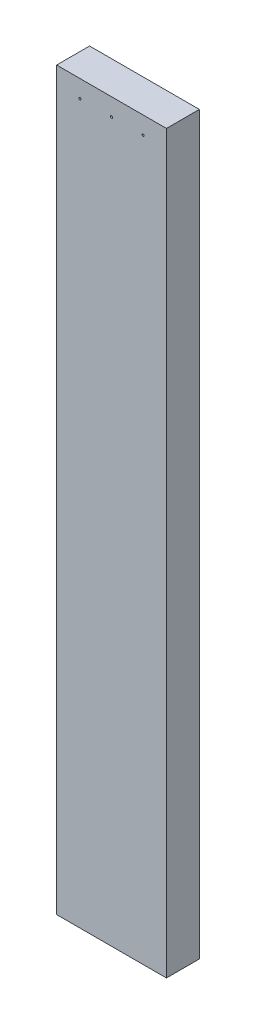
ISO-10303-21;
HEADER;
FILE_DESCRIPTION(('STEP AP214'),'2;1');
FILE_NAME('part.step','',(''),(''),'','','');
FILE_SCHEMA(('AUTOMOTIVE_DESIGN { 1 0 10303 214 1 1 1 1 }'));
ENDSEC;
DATA;
#1=APPLICATION_CONTEXT('core data for automotive mechanical design processes');
#2=APPLICATION_PROTOCOL_DEFINITION('international standard','automotive_design',2000,#1);
#3=PRODUCT_CONTEXT('',#1,'mechanical');
#4=PRODUCT('Part','Part','',(#3));
#5=PRODUCT_RELATED_PRODUCT_CATEGORY('part','',(#4));
#6=PRODUCT_DEFINITION_FORMATION('','',#4);
#7=PRODUCT_DEFINITION_CONTEXT('part definition',#1,'design');
#8=PRODUCT_DEFINITION('design','',#6,#7);
#9=PRODUCT_DEFINITION_SHAPE('','',#8);
#10=(LENGTH_UNIT() NAMED_UNIT(*) SI_UNIT(.MILLI.,.METRE.));
#11=(NAMED_UNIT(*) PLANE_ANGLE_UNIT() SI_UNIT($,.RADIAN.));
#12=(NAMED_UNIT(*) SI_UNIT($,.STERADIAN.) SOLID_ANGLE_UNIT());
#13=UNCERTAINTY_MEASURE_WITH_UNIT(LENGTH_MEASURE(1.E-05),#10,'distance_accuracy_value','');
#14=(GEOMETRIC_REPRESENTATION_CONTEXT(3) GLOBAL_UNCERTAINTY_ASSIGNED_CONTEXT((#13)) GLOBAL_UNIT_ASSIGNED_CONTEXT((#10,
#11,#12)) REPRESENTATION_CONTEXT('',''));
#15=CARTESIAN_POINT('',(0.,0.,0.));
#16=DIRECTION('',(0.,0.,1.));
#17=DIRECTION('',(1.,0.,0.));
#18=AXIS2_PLACEMENT_3D('',#15,#16,#17);
#19=CARTESIAN_POINT('',(0.,425.45,0.));
#20=DIRECTION('',(1.,0.,0.));
#21=DIRECTION('',(0.,0.,-1.));
#22=AXIS2_PLACEMENT_3D('',#19,#20,#21);
#23=PLANE('',#22);
#24=DIRECTION('',(0.,0.,1.));
#25=VECTOR('',#24,1.);
#26=CARTESIAN_POINT('',(0.,0.,0.));
#27=LINE('',#26,#25);
#28=CARTESIAN_POINT('',(0.,0.,-19.05));
#29=VERTEX_POINT('',#28);
#30=CARTESIAN_POINT('',(0.,0.,0.));
#31=VERTEX_POINT('',#30);
#32=EDGE_CURVE('E107',#29,#31,#27,.T.);
#33=ORIENTED_EDGE('',*,*,#32,.T.);
#34=DIRECTION('',(0.,-1.,0.));
#35=VECTOR('',#34,1.);
#36=CARTESIAN_POINT('',(0.,425.45,0.));
#37=LINE('',#36,#35);
#38=CARTESIAN_POINT('',(0.,425.45,0.));
#39=VERTEX_POINT('',#38);
#40=EDGE_CURVE('E11',#39,#31,#37,.T.);
#41=ORIENTED_EDGE('',*,*,#40,.F.);
#42=DIRECTION('',(0.,0.,1.));
#43=VECTOR('',#42,1.);
#44=CARTESIAN_POINT('',(0.,425.45,0.));
#45=LINE('',#44,#43);
#46=CARTESIAN_POINT('',(0.,425.45,-19.05));
#47=VERTEX_POINT('',#46);
#48=EDGE_CURVE('E94',#47,#39,#45,.T.);
#49=ORIENTED_EDGE('',*,*,#48,.F.);
#50=DIRECTION('',(0.,-1.,0.));
#51=VECTOR('',#50,1.);
#52=CARTESIAN_POINT('',(0.,425.45,-19.05));
#53=LINE('',#52,#51);
#54=EDGE_CURVE('E103',#47,#29,#53,.T.);
#55=ORIENTED_EDGE('',*,*,#54,.T.);
#56=EDGE_LOOP('',(#33,#41,#49,#55));
#57=FACE_BOUND('',#56,.T.);
#58=ADVANCED_FACE('F41',(#57),#23,.F.);
#59=CARTESIAN_POINT('',(0.,425.45,0.));
#60=DIRECTION('',(0.,0.,-1.));
#61=DIRECTION('',(-1.,0.,0.));
#62=AXIS2_PLACEMENT_3D('',#59,#60,#61);
#63=PLANE('',#62);
#64=CARTESIAN_POINT('',(13.4873999999976,415.29,0.));
#65=DIRECTION('',(0.,0.,1.));
#66=DIRECTION('',(-1.,0.,0.));
#67=AXIS2_PLACEMENT_3D('',#64,#65,#66);
#68=CIRCLE('',#67,0.634999999999979);
#69=CARTESIAN_POINT('',(12.8523999999976,415.29,0.));
#70=VERTEX_POINT('',#69);
#71=EDGE_CURVE('E158',#70,#70,#68,.T.);
#72=ORIENTED_EDGE('',*,*,#71,.F.);
#73=EDGE_LOOP('',(#72));
#74=FACE_BOUND('',#73,.T.);
#75=CARTESIAN_POINT('',(50.0126000000024,415.29,0.));
#76=DIRECTION('',(0.,0.,1.));
#77=DIRECTION('',(1.,0.,0.));
#78=AXIS2_PLACEMENT_3D('',#75,#76,#77);
#79=CIRCLE('',#78,0.634999999999979);
#80=CARTESIAN_POINT('',(50.6476000000024,415.29,0.));
#81=VERTEX_POINT('',#80);
#82=EDGE_CURVE('E153',#81,#81,#79,.T.);
#83=ORIENTED_EDGE('',*,*,#82,.F.);
#84=EDGE_LOOP('',(#83));
#85=FACE_BOUND('',#84,.T.);
#86=CARTESIAN_POINT('',(31.75,415.29,0.));
#87=DIRECTION('',(0.,0.,1.));
#88=DIRECTION('',(1.,0.,0.));
#89=AXIS2_PLACEMENT_3D('',#86,#87,#88);
#90=CIRCLE('',#89,0.634999999999992);
#91=CARTESIAN_POINT('',(32.385,415.29,0.));
#92=VERTEX_POINT('',#91);
#93=EDGE_CURVE('E142',#92,#92,#90,.T.);
#94=ORIENTED_EDGE('',*,*,#93,.F.);
#95=EDGE_LOOP('',(#94));
#96=FACE_BOUND('',#95,.T.);
#97=DIRECTION('',(1.,0.,0.));
#98=VECTOR('',#97,1.);
#99=CARTESIAN_POINT('',(0.,0.,0.));
#100=LINE('',#99,#98);
#101=CARTESIAN_POINT('',(63.5,0.,0.));
#102=VERTEX_POINT('',#101);
#103=EDGE_CURVE('E98',#31,#102,#100,.T.);
#104=ORIENTED_EDGE('',*,*,#103,.T.);
#105=DIRECTION('',(0.,-1.,0.));
#106=VECTOR('',#105,1.);
#107=CARTESIAN_POINT('',(63.5,425.45,0.));
#108=LINE('',#107,#106);
#109=CARTESIAN_POINT('',(63.5,425.45,0.));
#110=VERTEX_POINT('',#109);
#111=EDGE_CURVE('E50',#110,#102,#108,.T.);
#112=ORIENTED_EDGE('',*,*,#111,.F.);
#113=DIRECTION('',(1.,0.,0.));
#114=VECTOR('',#113,1.);
#115=CARTESIAN_POINT('',(0.,425.45,0.));
#116=LINE('',#115,#114);
#117=EDGE_CURVE('E89',#39,#110,#116,.T.);
#118=ORIENTED_EDGE('',*,*,#117,.F.);
#119=ORIENTED_EDGE('',*,*,#40,.T.);
#120=EDGE_LOOP('',(#104,#112,#118,#119));
#121=FACE_BOUND('',#120,.T.);
#122=ADVANCED_FACE('F97',(#74,#85,#96,#121),#63,.F.);
#123=CARTESIAN_POINT('',(63.5,425.45,0.));
#124=DIRECTION('',(-1.,0.,0.));
#125=DIRECTION('',(0.,0.,1.));
#126=AXIS2_PLACEMENT_3D('',#123,#124,#125);
#127=PLANE('',#126);
#128=DIRECTION('',(0.,0.,-1.));
#129=VECTOR('',#128,1.);
#130=CARTESIAN_POINT('',(63.5,0.,0.));
#131=LINE('',#130,#129);
#132=CARTESIAN_POINT('',(63.5,0.,-19.05));
#133=VERTEX_POINT('',#132);
#134=EDGE_CURVE('E76',#102,#133,#131,.T.);
#135=ORIENTED_EDGE('',*,*,#134,.T.);
#136=DIRECTION('',(0.,-1.,0.));
#137=VECTOR('',#136,1.);
#138=CARTESIAN_POINT('',(63.5,425.45,-19.05));
#139=LINE('',#138,#137);
#140=CARTESIAN_POINT('',(63.5,425.45,-19.05));
#141=VERTEX_POINT('',#140);
#142=EDGE_CURVE('E99',#141,#133,#139,.T.);
#143=ORIENTED_EDGE('',*,*,#142,.F.);
#144=DIRECTION('',(0.,0.,-1.));
#145=VECTOR('',#144,1.);
#146=CARTESIAN_POINT('',(63.5,425.45,0.));
#147=LINE('',#146,#145);
#148=EDGE_CURVE('E92',#110,#141,#147,.T.);
#149=ORIENTED_EDGE('',*,*,#148,.F.);
#150=ORIENTED_EDGE('',*,*,#111,.T.);
#151=EDGE_LOOP('',(#135,#143,#149,#150));
#152=FACE_BOUND('',#151,.T.);
#153=ADVANCED_FACE('F101',(#152),#127,.F.);
#154=CARTESIAN_POINT('',(0.,425.45,-19.05));
#155=DIRECTION('',(0.,0.,1.));
#156=DIRECTION('',(1.,0.,0.));
#157=AXIS2_PLACEMENT_3D('',#154,#155,#156);
#158=PLANE('',#157);
#159=CARTESIAN_POINT('',(13.4873999999976,415.29,-19.05));
#160=DIRECTION('',(0.,0.,1.));
#161=DIRECTION('',(-1.,0.,0.));
#162=AXIS2_PLACEMENT_3D('',#159,#160,#161);
#163=CIRCLE('',#162,0.634999999999979);
#164=CARTESIAN_POINT('',(12.8523999999976,415.29,-19.05));
#165=VERTEX_POINT('',#164);
#166=EDGE_CURVE('E155',#165,#165,#163,.T.);
#167=ORIENTED_EDGE('',*,*,#166,.T.);
#168=EDGE_LOOP('',(#167));
#169=FACE_BOUND('',#168,.T.);
#170=CARTESIAN_POINT('',(50.0126000000024,415.29,-19.05));
#171=DIRECTION('',(0.,0.,1.));
#172=DIRECTION('',(1.,0.,0.));
#173=AXIS2_PLACEMENT_3D('',#170,#171,#172);
#174=CIRCLE('',#173,0.634999999999979);
#175=CARTESIAN_POINT('',(50.6476000000024,415.29,-19.05));
#176=VERTEX_POINT('',#175);
#177=EDGE_CURVE('E161',#176,#176,#174,.T.);
#178=ORIENTED_EDGE('',*,*,#177,.T.);
#179=EDGE_LOOP('',(#178));
#180=FACE_BOUND('',#179,.T.);
#181=CARTESIAN_POINT('',(31.75,415.29,-19.05));
#182=DIRECTION('',(0.,0.,1.));
#183=DIRECTION('',(1.,0.,0.));
#184=AXIS2_PLACEMENT_3D('',#181,#182,#183);
#185=CIRCLE('',#184,0.634999999999992);
#186=CARTESIAN_POINT('',(32.385,415.29,-19.05));
#187=VERTEX_POINT('',#186);
#188=EDGE_CURVE('E146',#187,#187,#185,.T.);
#189=ORIENTED_EDGE('',*,*,#188,.T.);
#190=EDGE_LOOP('',(#189));
#191=FACE_BOUND('',#190,.T.);
#192=DIRECTION('',(-1.,0.,0.));
#193=VECTOR('',#192,1.);
#194=CARTESIAN_POINT('',(0.,0.,-19.05));
#195=LINE('',#194,#193);
#196=EDGE_CURVE('E82',#133,#29,#195,.T.);
#197=ORIENTED_EDGE('',*,*,#196,.T.);
#198=ORIENTED_EDGE('',*,*,#54,.F.);
#199=DIRECTION('',(-1.,0.,0.));
#200=VECTOR('',#199,1.);
#201=CARTESIAN_POINT('',(0.,425.45,-19.05));
#202=LINE('',#201,#200);
#203=EDGE_CURVE('E59',#141,#47,#202,.T.);
#204=ORIENTED_EDGE('',*,*,#203,.F.);
#205=ORIENTED_EDGE('',*,*,#142,.T.);
#206=EDGE_LOOP('',(#197,#198,#204,#205));
#207=FACE_BOUND('',#206,.T.);
#208=ADVANCED_FACE('F205',(#169,#180,#191,#207),#158,.F.);
#209=CARTESIAN_POINT('',(0.,425.45,0.));
#210=DIRECTION('',(0.,-1.,0.));
#211=DIRECTION('',(0.,0.,-1.));
#212=AXIS2_PLACEMENT_3D('',#209,#210,#211);
#213=PLANE('',#212);
#214=ORIENTED_EDGE('',*,*,#48,.T.);
#215=ORIENTED_EDGE('',*,*,#117,.T.);
#216=ORIENTED_EDGE('',*,*,#148,.T.);
#217=ORIENTED_EDGE('',*,*,#203,.T.);
#218=EDGE_LOOP('',(#214,#215,#216,#217));
#219=FACE_BOUND('',#218,.T.);
#220=ADVANCED_FACE('F90',(#219),#213,.F.);
#221=CARTESIAN_POINT('',(0.,0.,0.));
#222=DIRECTION('',(0.,-1.,0.));
#223=DIRECTION('',(0.,0.,-1.));
#224=AXIS2_PLACEMENT_3D('',#221,#222,#223);
#225=PLANE('',#224);
#226=CARTESIAN_POINT('',(13.4874000000025,0.,-9.52500000000392));
#227=DIRECTION('',(0.,-1.,0.));
#228=DIRECTION('',(0.,0.,-1.));
#229=AXIS2_PLACEMENT_3D('',#226,#227,#228);
#230=CIRCLE('',#229,0.635000000000015);
#231=CARTESIAN_POINT('',(13.4874000000025,0.,-10.1600000000039));
#232=VERTEX_POINT('',#231);
#233=EDGE_CURVE('E44',#232,#232,#230,.F.);
#234=ORIENTED_EDGE('',*,*,#233,.T.);
#235=EDGE_LOOP('',(#234));
#236=FACE_BOUND('',#235,.T.);
#237=CARTESIAN_POINT('',(31.7500000000025,0.,-9.52500000000392));
#238=DIRECTION('',(0.,-1.,0.));
#239=DIRECTION('',(0.,0.,-1.));
#240=AXIS2_PLACEMENT_3D('',#237,#238,#239);
#241=CIRCLE('',#240,0.635000000000002);
#242=CARTESIAN_POINT('',(31.7500000000025,0.,-10.1600000000039));
#243=VERTEX_POINT('',#242);
#244=EDGE_CURVE('E117',#243,#243,#241,.F.);
#245=ORIENTED_EDGE('',*,*,#244,.T.);
#246=EDGE_LOOP('',(#245));
#247=FACE_BOUND('',#246,.T.);
#248=CARTESIAN_POINT('',(50.0126000000025,0.,-9.52500000000399));
#249=DIRECTION('',(0.,-1.,0.));
#250=DIRECTION('',(0.,0.,-1.));
#251=AXIS2_PLACEMENT_3D('',#248,#249,#250);
#252=CIRCLE('',#251,0.634999999999988);
#253=CARTESIAN_POINT('',(50.0126000000025,0.,-10.160000000004));
#254=VERTEX_POINT('',#253);
#255=EDGE_CURVE('E115',#254,#254,#252,.F.);
#256=ORIENTED_EDGE('',*,*,#255,.T.);
#257=EDGE_LOOP('',(#256));
#258=FACE_BOUND('',#257,.T.);
#259=ORIENTED_EDGE('',*,*,#32,.F.);
#260=ORIENTED_EDGE('',*,*,#196,.F.);
#261=ORIENTED_EDGE('',*,*,#134,.F.);
#262=ORIENTED_EDGE('',*,*,#103,.F.);
#263=EDGE_LOOP('',(#259,#260,#261,#262));
#264=FACE_BOUND('',#263,.T.);
#265=ADVANCED_FACE('F125',(#236,#247,#258,#264),#225,.T.);
#266=CARTESIAN_POINT('',(50.0126000000025,-1.2E-05,-9.52500000000399));
#267=DIRECTION('',(0.,1.,0.));
#268=DIRECTION('',(0.,0.,1.));
#269=AXIS2_PLACEMENT_3D('',#266,#267,#268);
#270=CYLINDRICAL_SURFACE('',#269,0.634999999999988);
#271=ORIENTED_EDGE('',*,*,#255,.F.);
#272=EDGE_LOOP('',(#271));
#273=FACE_BOUND('',#272,.T.);
#274=CARTESIAN_POINT('',(50.0126000000025,50.8,-9.52500000000399));
#275=DIRECTION('',(0.,-1.,0.));
#276=DIRECTION('',(0.,0.,-1.));
#277=AXIS2_PLACEMENT_3D('',#274,#275,#276);
#278=CIRCLE('',#277,0.634999999999988);
#279=CARTESIAN_POINT('',(50.0126000000025,50.8,-10.160000000004));
#280=VERTEX_POINT('',#279);
#281=EDGE_CURVE('E139',#280,#280,#278,.T.);
#282=ORIENTED_EDGE('',*,*,#281,.F.);
#283=EDGE_LOOP('',(#282));
#284=FACE_BOUND('',#283,.T.);
#285=ADVANCED_FACE('F196',(#273,#284),#270,.F.);
#286=CARTESIAN_POINT('',(50.0126000000025,50.8,-9.52500000000399));
#287=DIRECTION('',(0.,-1.,0.));
#288=DIRECTION('',(0.,0.,-1.));
#289=AXIS2_PLACEMENT_3D('',#286,#287,#288);
#290=PLANE('',#289);
#291=ORIENTED_EDGE('',*,*,#281,.T.);
#292=EDGE_LOOP('',(#291));
#293=FACE_BOUND('',#292,.T.);
#294=ADVANCED_FACE('F202',(#293),#290,.T.);
#295=CARTESIAN_POINT('',(31.7500000000025,-1.2E-05,-9.52500000000392));
#296=DIRECTION('',(0.,1.,0.));
#297=DIRECTION('',(0.,0.,1.));
#298=AXIS2_PLACEMENT_3D('',#295,#296,#297);
#299=CYLINDRICAL_SURFACE('',#298,0.635000000000002);
#300=ORIENTED_EDGE('',*,*,#244,.F.);
#301=EDGE_LOOP('',(#300));
#302=FACE_BOUND('',#301,.T.);
#303=CARTESIAN_POINT('',(31.7500000000025,50.8,-9.52500000000392));
#304=DIRECTION('',(0.,-1.,0.));
#305=DIRECTION('',(0.,0.,-1.));
#306=AXIS2_PLACEMENT_3D('',#303,#304,#305);
#307=CIRCLE('',#306,0.635000000000002);
#308=CARTESIAN_POINT('',(31.7500000000025,50.8,-10.1600000000039));
#309=VERTEX_POINT('',#308);
#310=EDGE_CURVE('E136',#309,#309,#307,.T.);
#311=ORIENTED_EDGE('',*,*,#310,.F.);
#312=EDGE_LOOP('',(#311));
#313=FACE_BOUND('',#312,.T.);
#314=ADVANCED_FACE('F243',(#302,#313),#299,.F.);
#315=CARTESIAN_POINT('',(31.7500000000025,50.8,-9.52500000000392));
#316=DIRECTION('',(0.,-1.,0.));
#317=DIRECTION('',(0.,0.,-1.));
#318=AXIS2_PLACEMENT_3D('',#315,#316,#317);
#319=PLANE('',#318);
#320=ORIENTED_EDGE('',*,*,#310,.T.);
#321=EDGE_LOOP('',(#320));
#322=FACE_BOUND('',#321,.T.);
#323=ADVANCED_FACE('F131',(#322),#319,.T.);
#324=CARTESIAN_POINT('',(13.4874000000025,-1.2E-05,-9.52500000000392));
#325=DIRECTION('',(0.,1.,0.));
#326=DIRECTION('',(0.,0.,1.));
#327=AXIS2_PLACEMENT_3D('',#324,#325,#326);
#328=CYLINDRICAL_SURFACE('',#327,0.635000000000015);
#329=ORIENTED_EDGE('',*,*,#233,.F.);
#330=EDGE_LOOP('',(#329));
#331=FACE_BOUND('',#330,.T.);
#332=CARTESIAN_POINT('',(13.4874000000025,50.8,-9.52500000000392));
#333=DIRECTION('',(0.,-1.,0.));
#334=DIRECTION('',(0.,0.,-1.));
#335=AXIS2_PLACEMENT_3D('',#332,#333,#334);
#336=CIRCLE('',#335,0.635000000000015);
#337=CARTESIAN_POINT('',(13.4874000000025,50.8,-10.1600000000039));
#338=VERTEX_POINT('',#337);
#339=EDGE_CURVE('E118',#338,#338,#336,.T.);
#340=ORIENTED_EDGE('',*,*,#339,.F.);
#341=EDGE_LOOP('',(#340));
#342=FACE_BOUND('',#341,.T.);
#343=ADVANCED_FACE('F127',(#331,#342),#328,.F.);
#344=CARTESIAN_POINT('',(13.4874000000025,50.8,-9.52500000000392));
#345=DIRECTION('',(0.,-1.,0.));
#346=DIRECTION('',(0.,0.,-1.));
#347=AXIS2_PLACEMENT_3D('',#344,#345,#346);
#348=PLANE('',#347);
#349=ORIENTED_EDGE('',*,*,#339,.T.);
#350=EDGE_LOOP('',(#349));
#351=FACE_BOUND('',#350,.T.);
#352=ADVANCED_FACE('F130',(#351),#348,.T.);
#353=CARTESIAN_POINT('',(31.75,415.29,-19.05));
#354=DIRECTION('',(0.,0.,1.));
#355=DIRECTION('',(1.,0.,0.));
#356=AXIS2_PLACEMENT_3D('',#353,#354,#355);
#357=CYLINDRICAL_SURFACE('',#356,0.634999999999992);
#358=ORIENTED_EDGE('',*,*,#188,.F.);
#359=EDGE_LOOP('',(#358));
#360=FACE_BOUND('',#359,.T.);
#361=ORIENTED_EDGE('',*,*,#93,.T.);
#362=EDGE_LOOP('',(#361));
#363=FACE_BOUND('',#362,.T.);
#364=ADVANCED_FACE('F174',(#360,#363),#357,.F.);
#365=CARTESIAN_POINT('',(50.0126000000024,415.29,-19.05));
#366=DIRECTION('',(0.,0.,1.));
#367=DIRECTION('',(1.,0.,0.));
#368=AXIS2_PLACEMENT_3D('',#365,#366,#367);
#369=CYLINDRICAL_SURFACE('',#368,0.634999999999979);
#370=ORIENTED_EDGE('',*,*,#177,.F.);
#371=EDGE_LOOP('',(#370));
#372=FACE_BOUND('',#371,.T.);
#373=ORIENTED_EDGE('',*,*,#82,.T.);
#374=EDGE_LOOP('',(#373));
#375=FACE_BOUND('',#374,.T.);
#376=ADVANCED_FACE('F167',(#372,#375),#369,.F.);
#377=CARTESIAN_POINT('',(13.4873999999976,415.29,-19.05));
#378=DIRECTION('',(0.,0.,1.));
#379=DIRECTION('',(1.,0.,0.));
#380=AXIS2_PLACEMENT_3D('',#377,#378,#379);
#381=CYLINDRICAL_SURFACE('',#380,0.634999999999979);
#382=ORIENTED_EDGE('',*,*,#166,.F.);
#383=EDGE_LOOP('',(#382));
#384=FACE_BOUND('',#383,.T.);
#385=ORIENTED_EDGE('',*,*,#71,.T.);
#386=EDGE_LOOP('',(#385));
#387=FACE_BOUND('',#386,.T.);
#388=ADVANCED_FACE('F182',(#384,#387),#381,.F.);
#389=CLOSED_SHELL('',(#58,#122,#153,#208,#220,#265,#285,#294,#314,#323,#343,#352,#364,#376,#388));
#390=MANIFOLD_SOLID_BREP('B2',#389);
#391=ADVANCED_BREP_SHAPE_REPRESENTATION('',(#18,#390),#14);
#392=SHAPE_DEFINITION_REPRESENTATION(#9,#391);
ENDSEC;
END-ISO-10303-21;
